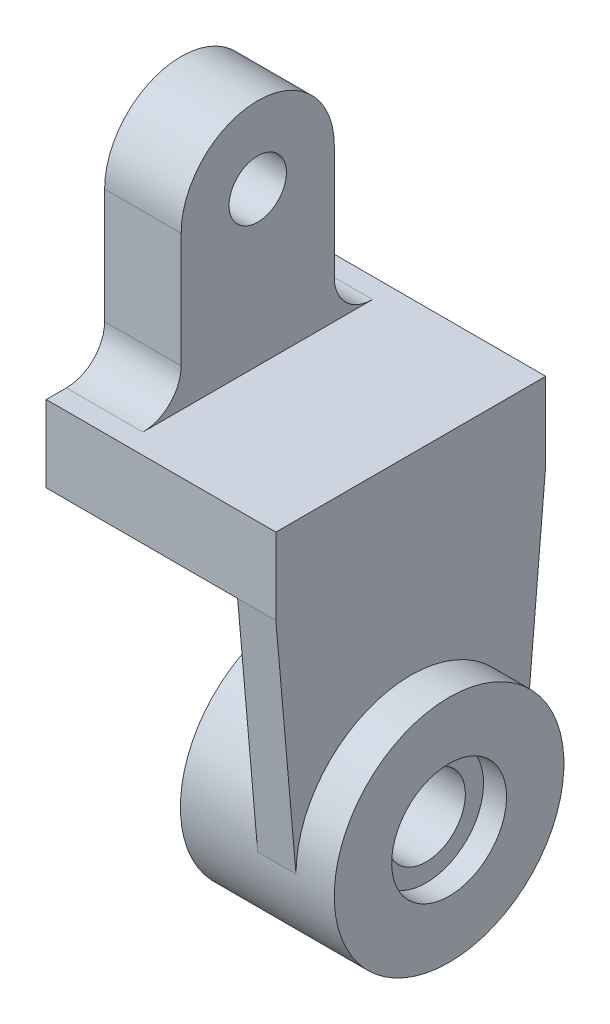
ISO-10303-21;
HEADER;
FILE_DESCRIPTION(('STEP AP214'),'2;1');
FILE_NAME('part.step','',(''),(''),'','','');
FILE_SCHEMA(('AUTOMOTIVE_DESIGN { 1 0 10303 214 1 1 1 1 }'));
ENDSEC;
DATA;
#1=APPLICATION_CONTEXT('core data for automotive mechanical design processes');
#2=APPLICATION_PROTOCOL_DEFINITION('international standard','automotive_design',2000,#1);
#3=PRODUCT_CONTEXT('',#1,'mechanical');
#4=PRODUCT('Part','Part','',(#3));
#5=PRODUCT_RELATED_PRODUCT_CATEGORY('part','',(#4));
#6=PRODUCT_DEFINITION_FORMATION('','',#4);
#7=PRODUCT_DEFINITION_CONTEXT('part definition',#1,'design');
#8=PRODUCT_DEFINITION('design','',#6,#7);
#9=PRODUCT_DEFINITION_SHAPE('','',#8);
#10=(LENGTH_UNIT() NAMED_UNIT(*) SI_UNIT(.MILLI.,.METRE.));
#11=(NAMED_UNIT(*) PLANE_ANGLE_UNIT() SI_UNIT($,.RADIAN.));
#12=(NAMED_UNIT(*) SI_UNIT($,.STERADIAN.) SOLID_ANGLE_UNIT());
#13=UNCERTAINTY_MEASURE_WITH_UNIT(LENGTH_MEASURE(1.E-05),#10,'distance_accuracy_value','');
#14=(GEOMETRIC_REPRESENTATION_CONTEXT(3) GLOBAL_UNCERTAINTY_ASSIGNED_CONTEXT((#13)) GLOBAL_UNIT_ASSIGNED_CONTEXT((#10,
#11,#12)) REPRESENTATION_CONTEXT('',''));
#15=CARTESIAN_POINT('',(0.,0.,0.));
#16=DIRECTION('',(0.,0.,1.));
#17=DIRECTION('',(1.,0.,0.));
#18=AXIS2_PLACEMENT_3D('',#15,#16,#17);
#19=CARTESIAN_POINT('',(-30.,10.,-70.5));
#20=DIRECTION('',(0.,1.,0.));
#21=DIRECTION('',(-1.,0.,0.));
#22=AXIS2_PLACEMENT_3D('',#19,#20,#21);
#23=PLANE('',#22);
#24=DIRECTION('',(0.,0.,1.));
#25=VECTOR('',#24,1.);
#26=CARTESIAN_POINT('',(-30.,10.,-70.5));
#27=LINE('',#26,#25);
#28=CARTESIAN_POINT('',(-30.,10.,-70.5));
#29=VERTEX_POINT('',#28);
#30=CARTESIAN_POINT('',(-30.,10.,-65.2500000000001));
#31=VERTEX_POINT('',#30);
#32=EDGE_CURVE('E53',#29,#31,#27,.T.);
#33=ORIENTED_EDGE('',*,*,#32,.T.);
#34=DIRECTION('',(-1.,0.,0.));
#35=VECTOR('',#34,1.);
#36=CARTESIAN_POINT('',(-10.,10.,-65.2500000000001));
#37=LINE('',#36,#35);
#38=CARTESIAN_POINT('',(-10.,10.,-65.2500000000001));
#39=VERTEX_POINT('',#38);
#40=EDGE_CURVE('E65',#39,#31,#37,.T.);
#41=ORIENTED_EDGE('',*,*,#40,.F.);
#42=DIRECTION('',(0.,0.,-1.));
#43=VECTOR('',#42,1.);
#44=CARTESIAN_POINT('',(-10.,10.,0.));
#45=LINE('',#44,#43);
#46=CARTESIAN_POINT('',(-10.,10.,-5.24999999999992));
#47=VERTEX_POINT('',#46);
#48=EDGE_CURVE('E60',#47,#39,#45,.T.);
#49=ORIENTED_EDGE('',*,*,#48,.F.);
#50=DIRECTION('',(-1.,0.,0.));
#51=VECTOR('',#50,1.);
#52=CARTESIAN_POINT('',(-10.,10.,-5.24999999999992));
#53=LINE('',#52,#51);
#54=CARTESIAN_POINT('',(-30.,10.,-5.24999999999992));
#55=VERTEX_POINT('',#54);
#56=EDGE_CURVE('E161',#47,#55,#53,.T.);
#57=ORIENTED_EDGE('',*,*,#56,.T.);
#58=CARTESIAN_POINT('',(-30.,10.,0.));
#59=VERTEX_POINT('',#58);
#60=EDGE_CURVE('E300',#55,#59,#27,.T.);
#61=ORIENTED_EDGE('',*,*,#60,.T.);
#62=DIRECTION('',(-1.,0.,0.));
#63=VECTOR('',#62,1.);
#64=CARTESIAN_POINT('',(-30.,10.,0.));
#65=LINE('',#64,#63);
#66=CARTESIAN_POINT('',(30.,10.,0.));
#67=VERTEX_POINT('',#66);
#68=EDGE_CURVE('E275',#67,#59,#65,.T.);
#69=ORIENTED_EDGE('',*,*,#68,.F.);
#70=DIRECTION('',(0.,0.,1.));
#71=VECTOR('',#70,1.);
#72=CARTESIAN_POINT('',(30.,10.,-70.5));
#73=LINE('',#72,#71);
#74=CARTESIAN_POINT('',(30.,10.,-70.5));
#75=VERTEX_POINT('',#74);
#76=EDGE_CURVE('E301',#75,#67,#73,.T.);
#77=ORIENTED_EDGE('',*,*,#76,.F.);
#78=DIRECTION('',(-1.,0.,0.));
#79=VECTOR('',#78,1.);
#80=CARTESIAN_POINT('',(-30.,10.,-70.5));
#81=LINE('',#80,#79);
#82=EDGE_CURVE('E281',#75,#29,#81,.T.);
#83=ORIENTED_EDGE('',*,*,#82,.T.);
#84=EDGE_LOOP('',(#33,#41,#49,#57,#61,#69,#77,#83));
#85=FACE_BOUND('',#84,.T.);
#86=ADVANCED_FACE('F43',(#85),#23,.T.);
#87=CARTESIAN_POINT('',(30.,10.,-70.5));
#88=DIRECTION('',(1.,0.,0.));
#89=DIRECTION('',(0.,1.,0.));
#90=AXIS2_PLACEMENT_3D('',#87,#88,#89);
#91=PLANE('',#90);
#92=DIRECTION('',(0.,1.,0.));
#93=VECTOR('',#92,1.);
#94=CARTESIAN_POINT('',(30.,10.,0.));
#95=LINE('',#94,#93);
#96=CARTESIAN_POINT('',(30.,-10.,0.));
#97=VERTEX_POINT('',#96);
#98=EDGE_CURVE('E292',#97,#67,#95,.T.);
#99=ORIENTED_EDGE('',*,*,#98,.F.);
#100=DIRECTION('',(0.,-0.996193717496113,-0.0871669502809097));
#101=VECTOR('',#100,1.);
#102=CARTESIAN_POINT('',(30.,-10.,0.));
#103=LINE('',#102,#101);
#104=CARTESIAN_POINT('',(30.,-70.,-5.24999999999999));
#105=VERTEX_POINT('',#104);
#106=EDGE_CURVE('E215',#97,#105,#103,.T.);
#107=ORIENTED_EDGE('',*,*,#106,.T.);
#108=CARTESIAN_POINT('',(30.,-70.,-35.25));
#109=DIRECTION('',(1.,0.,0.));
#110=DIRECTION('',(0.,1.,0.));
#111=AXIS2_PLACEMENT_3D('',#108,#109,#110);
#112=CIRCLE('',#111,30.);
#113=CARTESIAN_POINT('',(30.,-70.,-65.25));
#114=VERTEX_POINT('',#113);
#115=EDGE_CURVE('E265',#114,#105,#112,.T.);
#116=ORIENTED_EDGE('',*,*,#115,.F.);
#117=DIRECTION('',(0.,0.996193717496113,-0.0871669502809097));
#118=VECTOR('',#117,1.);
#119=CARTESIAN_POINT('',(30.,-70.,-65.25));
#120=LINE('',#119,#118);
#121=CARTESIAN_POINT('',(30.,-10.,-70.5));
#122=VERTEX_POINT('',#121);
#123=EDGE_CURVE('E220',#114,#122,#120,.T.);
#124=ORIENTED_EDGE('',*,*,#123,.T.);
#125=DIRECTION('',(0.,1.,0.));
#126=VECTOR('',#125,1.);
#127=CARTESIAN_POINT('',(30.,10.,-70.5));
#128=LINE('',#127,#126);
#129=EDGE_CURVE('E278',#122,#75,#128,.T.);
#130=ORIENTED_EDGE('',*,*,#129,.T.);
#131=ORIENTED_EDGE('',*,*,#76,.T.);
#132=EDGE_LOOP('',(#99,#107,#116,#124,#130,#131));
#133=FACE_BOUND('',#132,.T.);
#134=ADVANCED_FACE('F350',(#133),#91,.T.);
#135=CARTESIAN_POINT('',(20.,-70.,-70.5));
#136=DIRECTION('',(-1.,0.,0.));
#137=DIRECTION('',(0.,-1.,0.));
#138=AXIS2_PLACEMENT_3D('',#135,#136,#137);
#139=PLANE('',#138);
#140=CARTESIAN_POINT('',(20.,-70.,-35.25));
#141=DIRECTION('',(-1.,0.,0.));
#142=DIRECTION('',(0.,-1.,0.));
#143=AXIS2_PLACEMENT_3D('',#140,#141,#142);
#144=CIRCLE('',#143,30.);
#145=CARTESIAN_POINT('',(20.,-70.,-5.24999999999999));
#146=VERTEX_POINT('',#145);
#147=CARTESIAN_POINT('',(20.,-70.,-65.25));
#148=VERTEX_POINT('',#147);
#149=EDGE_CURVE('E11',#146,#148,#144,.T.);
#150=ORIENTED_EDGE('',*,*,#149,.F.);
#151=DIRECTION('',(0.,0.996193717496113,0.0871669502809097));
#152=VECTOR('',#151,1.);
#153=CARTESIAN_POINT('',(20.,-75.6659947278648,-5.74577453868817));
#154=LINE('',#153,#152);
#155=CARTESIAN_POINT('',(20.,-10.,0.));
#156=VERTEX_POINT('',#155);
#157=EDGE_CURVE('E233',#146,#156,#154,.T.);
#158=ORIENTED_EDGE('',*,*,#157,.T.);
#159=DIRECTION('',(0.,0.,1.));
#160=VECTOR('',#159,1.);
#161=CARTESIAN_POINT('',(20.,-10.,-70.5));
#162=LINE('',#161,#160);
#163=CARTESIAN_POINT('',(20.,-10.,-70.5));
#164=VERTEX_POINT('',#163);
#165=EDGE_CURVE('E305',#164,#156,#162,.T.);
#166=ORIENTED_EDGE('',*,*,#165,.F.);
#167=DIRECTION('',(0.,-0.996193717496113,0.0871669502809097));
#168=VECTOR('',#167,1.);
#169=CARTESIAN_POINT('',(20.,-69.5441153667235,-65.2898899054117));
#170=LINE('',#169,#168);
#171=EDGE_CURVE('E224',#164,#148,#170,.T.);
#172=ORIENTED_EDGE('',*,*,#171,.T.);
#173=EDGE_LOOP('',(#150,#158,#166,#172));
#174=FACE_BOUND('',#173,.T.);
#175=ADVANCED_FACE('F355',(#174),#139,.T.);
#176=CARTESIAN_POINT('',(0.,0.,-70.5));
#177=DIRECTION('',(0.,0.,1.));
#178=DIRECTION('',(1.,0.,0.));
#179=AXIS2_PLACEMENT_3D('',#176,#177,#178);
#180=PLANE('',#179);
#181=DIRECTION('',(1.,0.,0.));
#182=VECTOR('',#181,1.);
#183=CARTESIAN_POINT('',(-23.,-10.,-70.5));
#184=LINE('',#183,#182);
#185=EDGE_CURVE('E204',#164,#122,#184,.T.);
#186=ORIENTED_EDGE('',*,*,#185,.F.);
#187=DIRECTION('',(1.,0.,0.));
#188=VECTOR('',#187,1.);
#189=CARTESIAN_POINT('',(-30.,-10.,-70.5));
#190=LINE('',#189,#188);
#191=CARTESIAN_POINT('',(-30.,-10.,-70.5));
#192=VERTEX_POINT('',#191);
#193=EDGE_CURVE('E274',#192,#164,#190,.T.);
#194=ORIENTED_EDGE('',*,*,#193,.F.);
#195=DIRECTION('',(0.,-1.,0.));
#196=VECTOR('',#195,1.);
#197=CARTESIAN_POINT('',(-30.,10.,-70.5));
#198=LINE('',#197,#196);
#199=EDGE_CURVE('E270',#29,#192,#198,.T.);
#200=ORIENTED_EDGE('',*,*,#199,.F.);
#201=ORIENTED_EDGE('',*,*,#82,.F.);
#202=ORIENTED_EDGE('',*,*,#129,.F.);
#203=EDGE_LOOP('',(#186,#194,#200,#201,#202));
#204=FACE_BOUND('',#203,.T.);
#205=ADVANCED_FACE('F362',(#204),#180,.F.);
#206=CARTESIAN_POINT('',(0.,0.,0.));
#207=DIRECTION('',(0.,0.,1.));
#208=DIRECTION('',(1.,0.,0.));
#209=AXIS2_PLACEMENT_3D('',#206,#207,#208);
#210=PLANE('',#209);
#211=DIRECTION('',(1.,0.,0.));
#212=VECTOR('',#211,1.);
#213=CARTESIAN_POINT('',(-30.,-10.,0.));
#214=LINE('',#213,#212);
#215=CARTESIAN_POINT('',(-30.,-10.,0.));
#216=VERTEX_POINT('',#215);
#217=EDGE_CURVE('E289',#216,#156,#214,.T.);
#218=ORIENTED_EDGE('',*,*,#217,.T.);
#219=DIRECTION('',(1.,0.,0.));
#220=VECTOR('',#219,1.);
#221=CARTESIAN_POINT('',(-23.,-10.,0.));
#222=LINE('',#221,#220);
#223=EDGE_CURVE('E219',#156,#97,#222,.T.);
#224=ORIENTED_EDGE('',*,*,#223,.T.);
#225=ORIENTED_EDGE('',*,*,#98,.T.);
#226=ORIENTED_EDGE('',*,*,#68,.T.);
#227=DIRECTION('',(0.,-1.,0.));
#228=VECTOR('',#227,1.);
#229=CARTESIAN_POINT('',(-30.,10.,0.));
#230=LINE('',#229,#228);
#231=EDGE_CURVE('E269',#59,#216,#230,.T.);
#232=ORIENTED_EDGE('',*,*,#231,.T.);
#233=EDGE_LOOP('',(#218,#224,#225,#226,#232));
#234=FACE_BOUND('',#233,.T.);
#235=ADVANCED_FACE('F321',(#234),#210,.T.);
#236=CARTESIAN_POINT('',(-52.,-70.,-35.25));
#237=DIRECTION('',(1.,0.,0.));
#238=DIRECTION('',(0.,1.,0.));
#239=AXIS2_PLACEMENT_3D('',#236,#237,#238);
#240=CYLINDRICAL_SURFACE('',#239,10.25);
#241=CARTESIAN_POINT('',(-0.199999999999999,-70.,-35.25));
#242=DIRECTION('',(1.,0.,0.));
#243=DIRECTION('',(0.,1.,0.));
#244=AXIS2_PLACEMENT_3D('',#241,#242,#243);
#245=CIRCLE('',#244,10.25);
#246=CARTESIAN_POINT('',(-0.2,-59.75,-35.25));
#247=VERTEX_POINT('',#246);
#248=EDGE_CURVE('E245',#247,#247,#245,.T.);
#249=ORIENTED_EDGE('',*,*,#248,.F.);
#250=EDGE_LOOP('',(#249));
#251=FACE_BOUND('',#250,.T.);
#252=CARTESIAN_POINT('',(34.,-70.,-35.25));
#253=DIRECTION('',(1.,0.,0.));
#254=DIRECTION('',(0.,1.,0.));
#255=AXIS2_PLACEMENT_3D('',#252,#253,#254);
#256=CIRCLE('',#255,10.25);
#257=CARTESIAN_POINT('',(34.,-59.75,-35.25));
#258=VERTEX_POINT('',#257);
#259=EDGE_CURVE('E47',#258,#258,#256,.F.);
#260=ORIENTED_EDGE('',*,*,#259,.F.);
#261=EDGE_LOOP('',(#260));
#262=FACE_BOUND('',#261,.T.);
#263=ADVANCED_FACE('F373',(#251,#262),#240,.F.);
#264=CARTESIAN_POINT('',(-30.,10.,-70.5));
#265=DIRECTION('',(-1.,0.,0.));
#266=DIRECTION('',(0.,-1.,0.));
#267=AXIS2_PLACEMENT_3D('',#264,#265,#266);
#268=PLANE('',#267);
#269=ORIENTED_EDGE('',*,*,#231,.F.);
#270=ORIENTED_EDGE('',*,*,#60,.F.);
#271=CARTESIAN_POINT('',(-30.,20.,-5.24999999999999));
#272=DIRECTION('',(-1.,0.,0.));
#273=DIRECTION('',(0.,-1.,0.));
#274=AXIS2_PLACEMENT_3D('',#271,#272,#273);
#275=CIRCLE('',#274,10.);
#276=CARTESIAN_POINT('',(-30.,20.0000000000001,-15.25));
#277=VERTEX_POINT('',#276);
#278=EDGE_CURVE('E185',#55,#277,#275,.F.);
#279=ORIENTED_EDGE('',*,*,#278,.T.);
#280=DIRECTION('',(0.,-1.,0.));
#281=VECTOR('',#280,1.);
#282=CARTESIAN_POINT('',(-30.,0.,-15.25));
#283=LINE('',#282,#281);
#284=CARTESIAN_POINT('',(-30.,50.,-15.25));
#285=VERTEX_POINT('',#284);
#286=EDGE_CURVE('E155',#285,#277,#283,.T.);
#287=ORIENTED_EDGE('',*,*,#286,.F.);
#288=CARTESIAN_POINT('',(-30.,50.,-35.25));
#289=DIRECTION('',(-1.,0.,0.));
#290=DIRECTION('',(0.,-1.,0.));
#291=AXIS2_PLACEMENT_3D('',#288,#289,#290);
#292=CIRCLE('',#291,20.);
#293=CARTESIAN_POINT('',(-30.,50.,-55.25));
#294=VERTEX_POINT('',#293);
#295=EDGE_CURVE('E190',#285,#294,#292,.T.);
#296=ORIENTED_EDGE('',*,*,#295,.T.);
#297=DIRECTION('',(0.,-1.,0.));
#298=VECTOR('',#297,1.);
#299=CARTESIAN_POINT('',(-30.,0.,-55.25));
#300=LINE('',#299,#298);
#301=CARTESIAN_POINT('',(-30.,20.0000000000001,-55.25));
#302=VERTEX_POINT('',#301);
#303=EDGE_CURVE('E194',#294,#302,#300,.T.);
#304=ORIENTED_EDGE('',*,*,#303,.T.);
#305=CARTESIAN_POINT('',(-30.,20.,-65.25));
#306=DIRECTION('',(-1.,0.,0.));
#307=DIRECTION('',(0.,-1.,0.));
#308=AXIS2_PLACEMENT_3D('',#305,#306,#307);
#309=CIRCLE('',#308,10.);
#310=EDGE_CURVE('E198',#302,#31,#309,.F.);
#311=ORIENTED_EDGE('',*,*,#310,.T.);
#312=ORIENTED_EDGE('',*,*,#32,.F.);
#313=ORIENTED_EDGE('',*,*,#199,.T.);
#314=DIRECTION('',(0.,0.,1.));
#315=VECTOR('',#314,1.);
#316=CARTESIAN_POINT('',(-30.,-10.,-70.5));
#317=LINE('',#316,#315);
#318=EDGE_CURVE('E285',#192,#216,#317,.T.);
#319=ORIENTED_EDGE('',*,*,#318,.T.);
#320=EDGE_LOOP('',(#269,#270,#279,#287,#296,#304,#311,#312,#313,#319));
#321=FACE_BOUND('',#320,.T.);
#322=CARTESIAN_POINT('',(-30.,50.,-35.25));
#323=DIRECTION('',(-1.,0.,0.));
#324=DIRECTION('',(0.,-1.,0.));
#325=AXIS2_PLACEMENT_3D('',#322,#323,#324);
#326=CIRCLE('',#325,7.5);
#327=CARTESIAN_POINT('',(-30.,42.5,-35.25));
#328=VERTEX_POINT('',#327);
#329=EDGE_CURVE('E181',#328,#328,#326,.T.);
#330=ORIENTED_EDGE('',*,*,#329,.F.);
#331=EDGE_LOOP('',(#330));
#332=FACE_BOUND('',#331,.T.);
#333=ADVANCED_FACE('F45',(#321,#332),#268,.T.);
#334=CARTESIAN_POINT('',(-30.,-10.,-70.5));
#335=DIRECTION('',(0.,-1.,0.));
#336=DIRECTION('',(0.,0.,-1.));
#337=AXIS2_PLACEMENT_3D('',#334,#335,#336);
#338=PLANE('',#337);
#339=ORIENTED_EDGE('',*,*,#217,.F.);
#340=ORIENTED_EDGE('',*,*,#318,.F.);
#341=ORIENTED_EDGE('',*,*,#193,.T.);
#342=ORIENTED_EDGE('',*,*,#165,.T.);
#343=EDGE_LOOP('',(#339,#340,#341,#342));
#344=FACE_BOUND('',#343,.T.);
#345=ADVANCED_FACE('F317',(#344),#338,.T.);
#346=CARTESIAN_POINT('',(-0.199999999999999,-70.,-35.25));
#347=DIRECTION('',(1.,0.,0.));
#348=DIRECTION('',(0.,1.,0.));
#349=AXIS2_PLACEMENT_3D('',#346,#347,#348);
#350=CYLINDRICAL_SURFACE('',#349,30.);
#351=CARTESIAN_POINT('',(-0.199999999999999,-70.,-35.25));
#352=DIRECTION('',(1.,0.,0.));
#353=DIRECTION('',(0.,1.,0.));
#354=AXIS2_PLACEMENT_3D('',#351,#352,#353);
#355=CIRCLE('',#354,30.);
#356=CARTESIAN_POINT('',(-0.200000000000001,-40.,-35.25));
#357=VERTEX_POINT('',#356);
#358=EDGE_CURVE('E253',#357,#357,#355,.T.);
#359=ORIENTED_EDGE('',*,*,#358,.T.);
#360=EDGE_LOOP('',(#359));
#361=FACE_BOUND('',#360,.T.);
#362=DIRECTION('',(1.,0.,0.));
#363=VECTOR('',#362,1.);
#364=CARTESIAN_POINT('',(-0.199999999999999,-70.,-5.24999999999999));
#365=LINE('',#364,#363);
#366=EDGE_CURVE('E257',#105,#146,#365,.F.);
#367=ORIENTED_EDGE('',*,*,#366,.T.);
#368=ORIENTED_EDGE('',*,*,#149,.T.);
#369=DIRECTION('',(1.,0.,0.));
#370=VECTOR('',#369,1.);
#371=CARTESIAN_POINT('',(-0.199999999999999,-70.,-65.25));
#372=LINE('',#371,#370);
#373=EDGE_CURVE('E261',#148,#114,#372,.T.);
#374=ORIENTED_EDGE('',*,*,#373,.T.);
#375=ORIENTED_EDGE('',*,*,#115,.T.);
#376=EDGE_LOOP('',(#367,#368,#374,#375));
#377=FACE_BOUND('',#376,.T.);
#378=CARTESIAN_POINT('',(40.,-70.,-35.25));
#379=DIRECTION('',(1.,0.,0.));
#380=DIRECTION('',(0.,1.,0.));
#381=AXIS2_PLACEMENT_3D('',#378,#379,#380);
#382=CIRCLE('',#381,30.);
#383=CARTESIAN_POINT('',(40.,-40.,-35.25));
#384=VERTEX_POINT('',#383);
#385=EDGE_CURVE('E249',#384,#384,#382,.T.);
#386=ORIENTED_EDGE('',*,*,#385,.F.);
#387=EDGE_LOOP('',(#386));
#388=FACE_BOUND('',#387,.T.);
#389=ADVANCED_FACE('F365',(#361,#377,#388),#350,.T.);
#390=CARTESIAN_POINT('',(-0.199999999999999,-70.,-35.25));
#391=DIRECTION('',(1.,0.,0.));
#392=DIRECTION('',(0.,1.,0.));
#393=AXIS2_PLACEMENT_3D('',#390,#391,#392);
#394=PLANE('',#393);
#395=ORIENTED_EDGE('',*,*,#248,.T.);
#396=EDGE_LOOP('',(#395));
#397=FACE_BOUND('',#396,.T.);
#398=ORIENTED_EDGE('',*,*,#358,.F.);
#399=EDGE_LOOP('',(#398));
#400=FACE_BOUND('',#399,.T.);
#401=ADVANCED_FACE('F370',(#397,#400),#394,.F.);
#402=CARTESIAN_POINT('',(40.,-70.,-35.25));
#403=DIRECTION('',(1.,0.,0.));
#404=DIRECTION('',(0.,1.,0.));
#405=AXIS2_PLACEMENT_3D('',#402,#403,#404);
#406=PLANE('',#405);
#407=CARTESIAN_POINT('',(40.,-70.,-35.25));
#408=DIRECTION('',(1.,0.,0.));
#409=DIRECTION('',(0.,1.,0.));
#410=AXIS2_PLACEMENT_3D('',#407,#408,#409);
#411=CIRCLE('',#410,15.);
#412=CARTESIAN_POINT('',(40.,-55.,-35.25));
#413=VERTEX_POINT('',#412);
#414=EDGE_CURVE('E237',#413,#413,#411,.T.);
#415=ORIENTED_EDGE('',*,*,#414,.F.);
#416=EDGE_LOOP('',(#415));
#417=FACE_BOUND('',#416,.T.);
#418=ORIENTED_EDGE('',*,*,#385,.T.);
#419=EDGE_LOOP('',(#418));
#420=FACE_BOUND('',#419,.T.);
#421=ADVANCED_FACE('F388',(#417,#420),#406,.T.);
#422=CARTESIAN_POINT('',(34.,-70.,-35.25));
#423=DIRECTION('',(1.,0.,0.));
#424=DIRECTION('',(0.,1.,0.));
#425=AXIS2_PLACEMENT_3D('',#422,#423,#424);
#426=PLANE('',#425);
#427=CARTESIAN_POINT('',(34.,-70.,-35.25));
#428=DIRECTION('',(1.,0.,0.));
#429=DIRECTION('',(0.,1.,0.));
#430=AXIS2_PLACEMENT_3D('',#427,#428,#429);
#431=CIRCLE('',#430,15.);
#432=CARTESIAN_POINT('',(34.,-55.,-35.25));
#433=VERTEX_POINT('',#432);
#434=EDGE_CURVE('E238',#433,#433,#431,.T.);
#435=ORIENTED_EDGE('',*,*,#434,.T.);
#436=EDGE_LOOP('',(#435));
#437=FACE_BOUND('',#436,.T.);
#438=ORIENTED_EDGE('',*,*,#259,.T.);
#439=EDGE_LOOP('',(#438));
#440=FACE_BOUND('',#439,.T.);
#441=ADVANCED_FACE('F391',(#437,#440),#426,.T.);
#442=CARTESIAN_POINT('',(34.,-70.,-35.25));
#443=DIRECTION('',(1.,0.,0.));
#444=DIRECTION('',(0.,1.,0.));
#445=AXIS2_PLACEMENT_3D('',#442,#443,#444);
#446=CYLINDRICAL_SURFACE('',#445,15.);
#447=ORIENTED_EDGE('',*,*,#434,.F.);
#448=EDGE_LOOP('',(#447));
#449=FACE_BOUND('',#448,.T.);
#450=ORIENTED_EDGE('',*,*,#414,.T.);
#451=EDGE_LOOP('',(#450));
#452=FACE_BOUND('',#451,.T.);
#453=ADVANCED_FACE('F386',(#449,#452),#446,.F.);
#454=CARTESIAN_POINT('',(-23.,-70.,-65.25));
#455=DIRECTION('',(0.,-0.0871669502809097,-0.996193717496113));
#456=DIRECTION('',(0.,0.996193717496113,-0.0871669502809097));
#457=AXIS2_PLACEMENT_3D('',#454,#455,#456);
#458=PLANE('',#457);
#459=ORIENTED_EDGE('',*,*,#185,.T.);
#460=ORIENTED_EDGE('',*,*,#123,.F.);
#461=ORIENTED_EDGE('',*,*,#373,.F.);
#462=ORIENTED_EDGE('',*,*,#171,.F.);
#463=EDGE_LOOP('',(#459,#460,#461,#462));
#464=FACE_BOUND('',#463,.T.);
#465=ADVANCED_FACE('F345',(#464),#458,.T.);
#466=CARTESIAN_POINT('',(-23.,-10.,0.));
#467=DIRECTION('',(0.,-0.0871669502809097,0.996193717496113));
#468=DIRECTION('',(0.,-0.996193717496113,-0.0871669502809097));
#469=AXIS2_PLACEMENT_3D('',#466,#467,#468);
#470=PLANE('',#469);
#471=ORIENTED_EDGE('',*,*,#366,.F.);
#472=ORIENTED_EDGE('',*,*,#106,.F.);
#473=ORIENTED_EDGE('',*,*,#223,.F.);
#474=ORIENTED_EDGE('',*,*,#157,.F.);
#475=EDGE_LOOP('',(#471,#472,#473,#474));
#476=FACE_BOUND('',#475,.T.);
#477=ADVANCED_FACE('F338',(#476),#470,.T.);
#478=CARTESIAN_POINT('',(-10.,20.,-65.25));
#479=DIRECTION('',(-1.,0.,0.));
#480=DIRECTION('',(0.,-1.,0.));
#481=AXIS2_PLACEMENT_3D('',#478,#479,#480);
#482=CYLINDRICAL_SURFACE('',#481,10.);
#483=ORIENTED_EDGE('',*,*,#310,.F.);
#484=DIRECTION('',(-1.,0.,0.));
#485=VECTOR('',#484,1.);
#486=CARTESIAN_POINT('',(-10.,20.0000000000001,-55.25));
#487=LINE('',#486,#485);
#488=CARTESIAN_POINT('',(-10.,20.0000000000001,-55.25));
#489=VERTEX_POINT('',#488);
#490=EDGE_CURVE('E205',#489,#302,#487,.T.);
#491=ORIENTED_EDGE('',*,*,#490,.F.);
#492=CARTESIAN_POINT('',(-10.,20.,-65.25));
#493=DIRECTION('',(-1.,0.,0.));
#494=DIRECTION('',(0.,-1.,0.));
#495=AXIS2_PLACEMENT_3D('',#492,#493,#494);
#496=CIRCLE('',#495,10.);
#497=EDGE_CURVE('E177',#489,#39,#496,.F.);
#498=ORIENTED_EDGE('',*,*,#497,.T.);
#499=ORIENTED_EDGE('',*,*,#40,.T.);
#500=EDGE_LOOP('',(#483,#491,#498,#499));
#501=FACE_BOUND('',#500,.T.);
#502=ADVANCED_FACE('F335',(#501),#482,.F.);
#503=CARTESIAN_POINT('',(-9.99999999999999,0.,-55.25));
#504=DIRECTION('',(0.,0.,-1.));
#505=DIRECTION('',(0.,1.,0.));
#506=AXIS2_PLACEMENT_3D('',#503,#504,#505);
#507=PLANE('',#506);
#508=ORIENTED_EDGE('',*,*,#303,.F.);
#509=DIRECTION('',(-1.,0.,0.));
#510=VECTOR('',#509,1.);
#511=CARTESIAN_POINT('',(-10.,50.,-55.25));
#512=LINE('',#511,#510);
#513=CARTESIAN_POINT('',(-10.,50.,-55.25));
#514=VERTEX_POINT('',#513);
#515=EDGE_CURVE('E208',#514,#294,#512,.T.);
#516=ORIENTED_EDGE('',*,*,#515,.F.);
#517=DIRECTION('',(0.,-1.,0.));
#518=VECTOR('',#517,1.);
#519=CARTESIAN_POINT('',(-9.99999999999999,0.,-55.25));
#520=LINE('',#519,#518);
#521=EDGE_CURVE('E173',#514,#489,#520,.T.);
#522=ORIENTED_EDGE('',*,*,#521,.T.);
#523=ORIENTED_EDGE('',*,*,#490,.T.);
#524=EDGE_LOOP('',(#508,#516,#522,#523));
#525=FACE_BOUND('',#524,.T.);
#526=ADVANCED_FACE('F332',(#525),#507,.T.);
#527=CARTESIAN_POINT('',(-10.,50.,-35.25));
#528=DIRECTION('',(-1.,0.,0.));
#529=DIRECTION('',(0.,-1.,0.));
#530=AXIS2_PLACEMENT_3D('',#527,#528,#529);
#531=CYLINDRICAL_SURFACE('',#530,20.);
#532=ORIENTED_EDGE('',*,*,#295,.F.);
#533=DIRECTION('',(-1.,0.,0.));
#534=VECTOR('',#533,1.);
#535=CARTESIAN_POINT('',(-10.,50.,-15.25));
#536=LINE('',#535,#534);
#537=CARTESIAN_POINT('',(-10.,50.,-15.25));
#538=VERTEX_POINT('',#537);
#539=EDGE_CURVE('E160',#538,#285,#536,.T.);
#540=ORIENTED_EDGE('',*,*,#539,.F.);
#541=CARTESIAN_POINT('',(-10.,50.,-35.25));
#542=DIRECTION('',(-1.,0.,0.));
#543=DIRECTION('',(0.,-1.,0.));
#544=AXIS2_PLACEMENT_3D('',#541,#542,#543);
#545=CIRCLE('',#544,20.);
#546=EDGE_CURVE('E147',#538,#514,#545,.T.);
#547=ORIENTED_EDGE('',*,*,#546,.T.);
#548=ORIENTED_EDGE('',*,*,#515,.T.);
#549=EDGE_LOOP('',(#532,#540,#547,#548));
#550=FACE_BOUND('',#549,.T.);
#551=ADVANCED_FACE('F329',(#550),#531,.T.);
#552=CARTESIAN_POINT('',(-9.99999999999999,0.,-15.25));
#553=DIRECTION('',(0.,0.,-1.));
#554=DIRECTION('',(0.,1.,0.));
#555=AXIS2_PLACEMENT_3D('',#552,#553,#554);
#556=PLANE('',#555);
#557=ORIENTED_EDGE('',*,*,#286,.T.);
#558=DIRECTION('',(-1.,0.,0.));
#559=VECTOR('',#558,1.);
#560=CARTESIAN_POINT('',(-10.,20.0000000000001,-15.25));
#561=LINE('',#560,#559);
#562=CARTESIAN_POINT('',(-10.,20.0000000000001,-15.25));
#563=VERTEX_POINT('',#562);
#564=EDGE_CURVE('E152',#563,#277,#561,.T.);
#565=ORIENTED_EDGE('',*,*,#564,.F.);
#566=DIRECTION('',(0.,-1.,0.));
#567=VECTOR('',#566,1.);
#568=CARTESIAN_POINT('',(-9.99999999999999,0.,-15.25));
#569=LINE('',#568,#567);
#570=EDGE_CURVE('E140',#538,#563,#569,.T.);
#571=ORIENTED_EDGE('',*,*,#570,.F.);
#572=ORIENTED_EDGE('',*,*,#539,.T.);
#573=EDGE_LOOP('',(#557,#565,#571,#572));
#574=FACE_BOUND('',#573,.T.);
#575=ADVANCED_FACE('F153',(#574),#556,.F.);
#576=CARTESIAN_POINT('',(-10.,50.,-35.25));
#577=DIRECTION('',(-1.,0.,0.));
#578=DIRECTION('',(0.,-1.,0.));
#579=AXIS2_PLACEMENT_3D('',#576,#577,#578);
#580=CYLINDRICAL_SURFACE('',#579,7.5);
#581=CARTESIAN_POINT('',(-10.,50.,-35.25));
#582=DIRECTION('',(-1.,0.,0.));
#583=DIRECTION('',(0.,-1.,0.));
#584=AXIS2_PLACEMENT_3D('',#581,#582,#583);
#585=CIRCLE('',#584,7.5);
#586=CARTESIAN_POINT('',(-10.,42.5,-35.25));
#587=VERTEX_POINT('',#586);
#588=EDGE_CURVE('E167',#587,#587,#585,.T.);
#589=ORIENTED_EDGE('',*,*,#588,.F.);
#590=EDGE_LOOP('',(#589));
#591=FACE_BOUND('',#590,.T.);
#592=ORIENTED_EDGE('',*,*,#329,.T.);
#593=EDGE_LOOP('',(#592));
#594=FACE_BOUND('',#593,.T.);
#595=ADVANCED_FACE('F529',(#591,#594),#580,.F.);
#596=CARTESIAN_POINT('',(-10.,20.,-5.24999999999999));
#597=DIRECTION('',(-1.,0.,0.));
#598=DIRECTION('',(0.,-1.,0.));
#599=AXIS2_PLACEMENT_3D('',#596,#597,#598);
#600=CYLINDRICAL_SURFACE('',#599,10.);
#601=ORIENTED_EDGE('',*,*,#278,.F.);
#602=ORIENTED_EDGE('',*,*,#56,.F.);
#603=CARTESIAN_POINT('',(-10.,20.,-5.24999999999999));
#604=DIRECTION('',(-1.,0.,0.));
#605=DIRECTION('',(0.,-1.,0.));
#606=AXIS2_PLACEMENT_3D('',#603,#604,#605);
#607=CIRCLE('',#606,10.);
#608=EDGE_CURVE('E144',#47,#563,#607,.F.);
#609=ORIENTED_EDGE('',*,*,#608,.T.);
#610=ORIENTED_EDGE('',*,*,#564,.T.);
#611=EDGE_LOOP('',(#601,#602,#609,#610));
#612=FACE_BOUND('',#611,.T.);
#613=ADVANCED_FACE('F163',(#612),#600,.F.);
#614=CARTESIAN_POINT('',(-9.99999999999999,0.,0.));
#615=DIRECTION('',(-1.,0.,0.));
#616=DIRECTION('',(0.,-1.,0.));
#617=AXIS2_PLACEMENT_3D('',#614,#615,#616);
#618=PLANE('',#617);
#619=ORIENTED_EDGE('',*,*,#588,.T.);
#620=EDGE_LOOP('',(#619));
#621=FACE_BOUND('',#620,.T.);
#622=ORIENTED_EDGE('',*,*,#48,.T.);
#623=ORIENTED_EDGE('',*,*,#497,.F.);
#624=ORIENTED_EDGE('',*,*,#521,.F.);
#625=ORIENTED_EDGE('',*,*,#546,.F.);
#626=ORIENTED_EDGE('',*,*,#570,.T.);
#627=ORIENTED_EDGE('',*,*,#608,.F.);
#628=EDGE_LOOP('',(#622,#623,#624,#625,#626,#627));
#629=FACE_BOUND('',#628,.T.);
#630=ADVANCED_FACE('F142',(#621,#629),#618,.F.);
#631=CLOSED_SHELL('',(#86,#134,#175,#205,#235,#263,#333,#345,#389,#401,#421,#441,#453,#465,#477,
#502,#526,#551,#575,#595,#613,#630));
#632=MANIFOLD_SOLID_BREP('B2',#631);
#633=ADVANCED_BREP_SHAPE_REPRESENTATION('',(#18,#632),#14);
#634=SHAPE_DEFINITION_REPRESENTATION(#9,#633);
ENDSEC;
END-ISO-10303-21;
